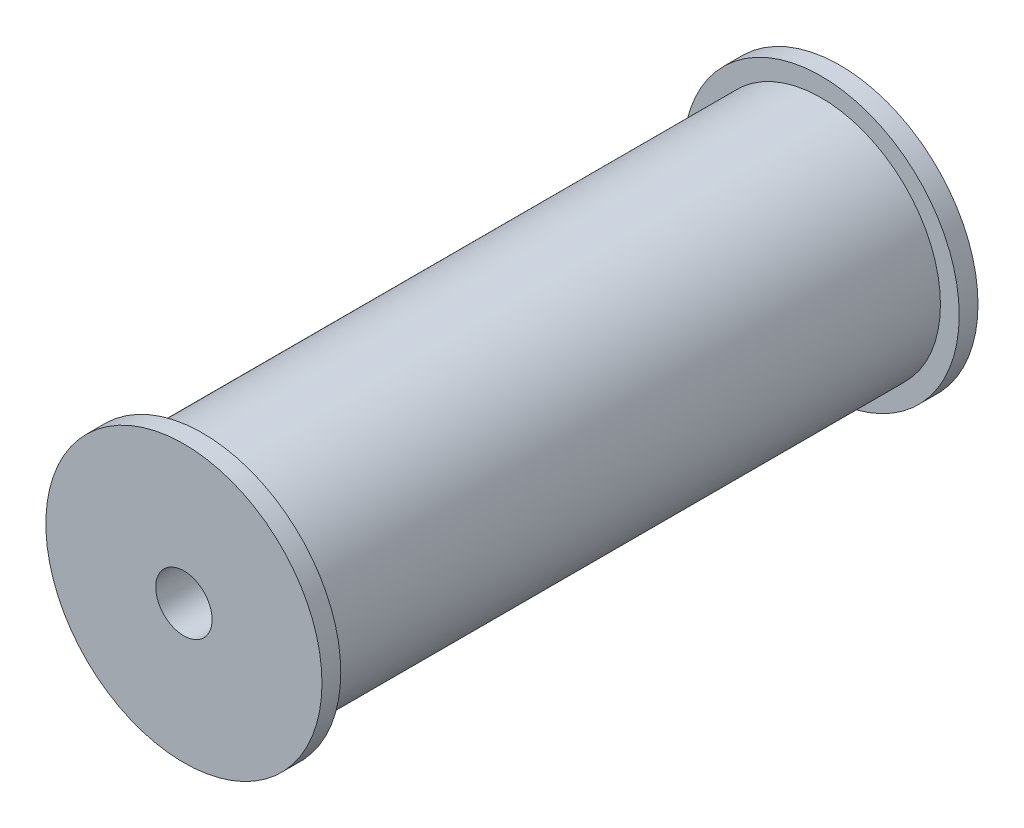
ISO-10303-21;
HEADER;
FILE_DESCRIPTION(('STEP AP214'),'2;1');
FILE_NAME('part.step','',(''),(''),'','','');
FILE_SCHEMA(('AUTOMOTIVE_DESIGN { 1 0 10303 214 1 1 1 1 }'));
ENDSEC;
DATA;
#1=APPLICATION_CONTEXT('core data for automotive mechanical design processes');
#2=APPLICATION_PROTOCOL_DEFINITION('international standard','automotive_design',2000,#1);
#3=PRODUCT_CONTEXT('',#1,'mechanical');
#4=PRODUCT('Part','Part','',(#3));
#5=PRODUCT_RELATED_PRODUCT_CATEGORY('part','',(#4));
#6=PRODUCT_DEFINITION_FORMATION('','',#4);
#7=PRODUCT_DEFINITION_CONTEXT('part definition',#1,'design');
#8=PRODUCT_DEFINITION('design','',#6,#7);
#9=PRODUCT_DEFINITION_SHAPE('','',#8);
#10=(LENGTH_UNIT() NAMED_UNIT(*) SI_UNIT(.MILLI.,.METRE.));
#11=(NAMED_UNIT(*) PLANE_ANGLE_UNIT() SI_UNIT($,.RADIAN.));
#12=(NAMED_UNIT(*) SI_UNIT($,.STERADIAN.) SOLID_ANGLE_UNIT());
#13=UNCERTAINTY_MEASURE_WITH_UNIT(LENGTH_MEASURE(1.E-05),#10,'distance_accuracy_value','');
#14=(GEOMETRIC_REPRESENTATION_CONTEXT(3) GLOBAL_UNCERTAINTY_ASSIGNED_CONTEXT((#13)) GLOBAL_UNIT_ASSIGNED_CONTEXT((#10,
#11,#12)) REPRESENTATION_CONTEXT('',''));
#15=CARTESIAN_POINT('',(0.,0.,0.));
#16=DIRECTION('',(0.,0.,1.));
#17=DIRECTION('',(1.,0.,0.));
#18=AXIS2_PLACEMENT_3D('',#15,#16,#17);
#19=CARTESIAN_POINT('',(0.,0.,69.85));
#20=DIRECTION('',(0.,0.,-1.));
#21=DIRECTION('',(-1.,0.,0.));
#22=AXIS2_PLACEMENT_3D('',#19,#20,#21);
#23=CYLINDRICAL_SURFACE('',#22,12.7);
#24=CARTESIAN_POINT('',(0.,0.,2.));
#25=DIRECTION('',(0.,0.,1.));
#26=DIRECTION('',(1.,0.,0.));
#27=AXIS2_PLACEMENT_3D('',#24,#25,#26);
#28=CIRCLE('',#27,12.7);
#29=CARTESIAN_POINT('',(12.7,0.,2.));
#30=VERTEX_POINT('',#29);
#31=EDGE_CURVE('E56',#30,#30,#28,.T.);
#32=ORIENTED_EDGE('',*,*,#31,.T.);
#33=EDGE_LOOP('',(#32));
#34=FACE_BOUND('',#33,.T.);
#35=CARTESIAN_POINT('',(0.,0.,67.85));
#36=DIRECTION('',(0.,0.,1.));
#37=DIRECTION('',(1.,0.,0.));
#38=AXIS2_PLACEMENT_3D('',#35,#36,#37);
#39=CIRCLE('',#38,12.7);
#40=CARTESIAN_POINT('',(12.7,0.,67.85));
#41=VERTEX_POINT('',#40);
#42=EDGE_CURVE('E10',#41,#41,#39,.T.);
#43=ORIENTED_EDGE('',*,*,#42,.F.);
#44=EDGE_LOOP('',(#43));
#45=FACE_BOUND('',#44,.T.);
#46=ADVANCED_FACE('F37',(#34,#45),#23,.T.);
#47=CARTESIAN_POINT('',(0.,0.,69.85));
#48=DIRECTION('',(0.,0.,1.));
#49=DIRECTION('',(1.,0.,0.));
#50=AXIS2_PLACEMENT_3D('',#47,#48,#49);
#51=PLANE('',#50);
#52=CARTESIAN_POINT('',(0.,0.,69.85));
#53=DIRECTION('',(0.,0.,1.));
#54=DIRECTION('',(1.,0.,0.));
#55=AXIS2_PLACEMENT_3D('',#52,#53,#54);
#56=CIRCLE('',#55,3.);
#57=CARTESIAN_POINT('',(3.,0.,69.85));
#58=VERTEX_POINT('',#57);
#59=EDGE_CURVE('E48',#58,#58,#56,.T.);
#60=ORIENTED_EDGE('',*,*,#59,.F.);
#61=EDGE_LOOP('',(#60));
#62=FACE_BOUND('',#61,.T.);
#63=CARTESIAN_POINT('',(0.,0.,69.85));
#64=DIRECTION('',(0.,0.,1.));
#65=DIRECTION('',(1.,0.,0.));
#66=AXIS2_PLACEMENT_3D('',#63,#64,#65);
#67=CIRCLE('',#66,14.7);
#68=CARTESIAN_POINT('',(14.7,0.,69.85));
#69=VERTEX_POINT('',#68);
#70=EDGE_CURVE('E51',#69,#69,#67,.T.);
#71=ORIENTED_EDGE('',*,*,#70,.T.);
#72=EDGE_LOOP('',(#71));
#73=FACE_BOUND('',#72,.T.);
#74=ADVANCED_FACE('F68',(#62,#73),#51,.T.);
#75=CARTESIAN_POINT('',(0.,0.,0.));
#76=DIRECTION('',(0.,0.,1.));
#77=DIRECTION('',(1.,0.,0.));
#78=AXIS2_PLACEMENT_3D('',#75,#76,#77);
#79=PLANE('',#78);
#80=CARTESIAN_POINT('',(0.,0.,0.));
#81=DIRECTION('',(0.,0.,1.));
#82=DIRECTION('',(1.,0.,0.));
#83=AXIS2_PLACEMENT_3D('',#80,#81,#82);
#84=CIRCLE('',#83,3.);
#85=CARTESIAN_POINT('',(3.,0.,0.));
#86=VERTEX_POINT('',#85);
#87=EDGE_CURVE('E40',#86,#86,#84,.F.);
#88=ORIENTED_EDGE('',*,*,#87,.F.);
#89=EDGE_LOOP('',(#88));
#90=FACE_BOUND('',#89,.T.);
#91=CARTESIAN_POINT('',(0.,0.,0.));
#92=DIRECTION('',(0.,0.,1.));
#93=DIRECTION('',(1.,0.,0.));
#94=AXIS2_PLACEMENT_3D('',#91,#92,#93);
#95=CIRCLE('',#94,14.7);
#96=CARTESIAN_POINT('',(14.7,0.,0.));
#97=VERTEX_POINT('',#96);
#98=EDGE_CURVE('E57',#97,#97,#95,.T.);
#99=ORIENTED_EDGE('',*,*,#98,.F.);
#100=EDGE_LOOP('',(#99));
#101=FACE_BOUND('',#100,.T.);
#102=ADVANCED_FACE('F71',(#90,#101),#79,.F.);
#103=CARTESIAN_POINT('',(0.,0.,-8.48528137423857));
#104=DIRECTION('',(0.,0.,1.));
#105=DIRECTION('',(1.,0.,0.));
#106=AXIS2_PLACEMENT_3D('',#103,#104,#105);
#107=CYLINDRICAL_SURFACE('',#106,3.);
#108=ORIENTED_EDGE('',*,*,#59,.T.);
#109=EDGE_LOOP('',(#108));
#110=FACE_BOUND('',#109,.T.);
#111=ORIENTED_EDGE('',*,*,#87,.T.);
#112=EDGE_LOOP('',(#111));
#113=FACE_BOUND('',#112,.T.);
#114=ADVANCED_FACE('F65',(#110,#113),#107,.F.);
#115=CARTESIAN_POINT('',(0.,0.,2.));
#116=DIRECTION('',(0.,0.,1.));
#117=DIRECTION('',(1.,0.,0.));
#118=AXIS2_PLACEMENT_3D('',#115,#116,#117);
#119=PLANE('',#118);
#120=CARTESIAN_POINT('',(0.,0.,2.));
#121=DIRECTION('',(0.,0.,1.));
#122=DIRECTION('',(1.,0.,0.));
#123=AXIS2_PLACEMENT_3D('',#120,#121,#122);
#124=CIRCLE('',#123,14.7);
#125=CARTESIAN_POINT('',(14.7,0.,2.));
#126=VERTEX_POINT('',#125);
#127=EDGE_CURVE('E53',#126,#126,#124,.T.);
#128=ORIENTED_EDGE('',*,*,#127,.T.);
#129=EDGE_LOOP('',(#128));
#130=FACE_BOUND('',#129,.T.);
#131=ORIENTED_EDGE('',*,*,#31,.F.);
#132=EDGE_LOOP('',(#131));
#133=FACE_BOUND('',#132,.T.);
#134=ADVANCED_FACE('F90',(#130,#133),#119,.T.);
#135=CARTESIAN_POINT('',(0.,0.,2.));
#136=DIRECTION('',(0.,0.,-1.));
#137=DIRECTION('',(-1.,0.,0.));
#138=AXIS2_PLACEMENT_3D('',#135,#136,#137);
#139=CYLINDRICAL_SURFACE('',#138,14.7);
#140=ORIENTED_EDGE('',*,*,#127,.F.);
#141=EDGE_LOOP('',(#140));
#142=FACE_BOUND('',#141,.T.);
#143=ORIENTED_EDGE('',*,*,#98,.T.);
#144=EDGE_LOOP('',(#143));
#145=FACE_BOUND('',#144,.T.);
#146=ADVANCED_FACE('F83',(#142,#145),#139,.T.);
#147=CARTESIAN_POINT('',(0.,0.,67.85));
#148=DIRECTION('',(0.,0.,1.));
#149=DIRECTION('',(1.,0.,0.));
#150=AXIS2_PLACEMENT_3D('',#147,#148,#149);
#151=PLANE('',#150);
#152=CARTESIAN_POINT('',(0.,0.,67.85));
#153=DIRECTION('',(0.,0.,1.));
#154=DIRECTION('',(1.,0.,0.));
#155=AXIS2_PLACEMENT_3D('',#152,#153,#154);
#156=CIRCLE('',#155,14.7);
#157=CARTESIAN_POINT('',(14.7,0.,67.85));
#158=VERTEX_POINT('',#157);
#159=EDGE_CURVE('E60',#158,#158,#156,.T.);
#160=ORIENTED_EDGE('',*,*,#159,.F.);
#161=EDGE_LOOP('',(#160));
#162=FACE_BOUND('',#161,.T.);
#163=ORIENTED_EDGE('',*,*,#42,.T.);
#164=EDGE_LOOP('',(#163));
#165=FACE_BOUND('',#164,.T.);
#166=ADVANCED_FACE('F81',(#162,#165),#151,.F.);
#167=CARTESIAN_POINT('',(0.,0.,67.85));
#168=DIRECTION('',(0.,0.,1.));
#169=DIRECTION('',(1.,0.,0.));
#170=AXIS2_PLACEMENT_3D('',#167,#168,#169);
#171=CYLINDRICAL_SURFACE('',#170,14.7);
#172=ORIENTED_EDGE('',*,*,#159,.T.);
#173=EDGE_LOOP('',(#172));
#174=FACE_BOUND('',#173,.T.);
#175=ORIENTED_EDGE('',*,*,#70,.F.);
#176=EDGE_LOOP('',(#175));
#177=FACE_BOUND('',#176,.T.);
#178=ADVANCED_FACE('F79',(#174,#177),#171,.T.);
#179=CLOSED_SHELL('',(#46,#74,#102,#114,#134,#146,#166,#178));
#180=MANIFOLD_SOLID_BREP('B2',#179);
#181=ADVANCED_BREP_SHAPE_REPRESENTATION('',(#18,#180),#14);
#182=SHAPE_DEFINITION_REPRESENTATION(#9,#181);
ENDSEC;
END-ISO-10303-21;
